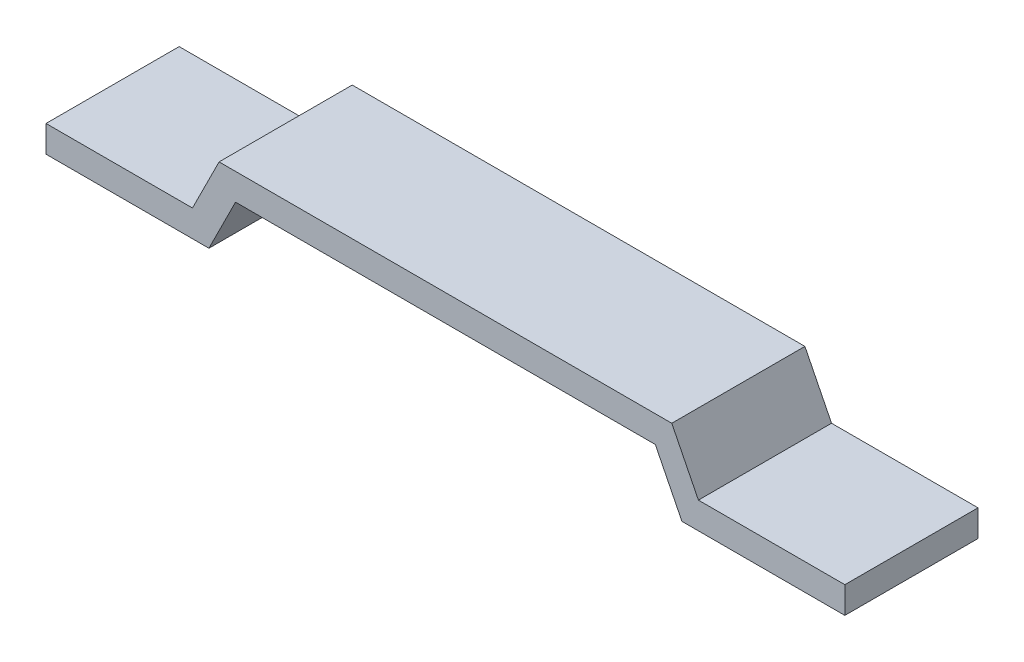
ISO-10303-21;
HEADER;
FILE_DESCRIPTION(('STEP AP214'),'2;1');
FILE_NAME('part.step','',(''),(''),'','','');
FILE_SCHEMA(('AUTOMOTIVE_DESIGN { 1 0 10303 214 1 1 1 1 }'));
ENDSEC;
DATA;
#1=APPLICATION_CONTEXT('core data for automotive mechanical design processes');
#2=APPLICATION_PROTOCOL_DEFINITION('international standard','automotive_design',2000,#1);
#3=PRODUCT_CONTEXT('',#1,'mechanical');
#4=PRODUCT('Part','Part','',(#3));
#5=PRODUCT_RELATED_PRODUCT_CATEGORY('part','',(#4));
#6=PRODUCT_DEFINITION_FORMATION('','',#4);
#7=PRODUCT_DEFINITION_CONTEXT('part definition',#1,'design');
#8=PRODUCT_DEFINITION('design','',#6,#7);
#9=PRODUCT_DEFINITION_SHAPE('','',#8);
#10=(LENGTH_UNIT() NAMED_UNIT(*) SI_UNIT(.MILLI.,.METRE.));
#11=(NAMED_UNIT(*) PLANE_ANGLE_UNIT() SI_UNIT($,.RADIAN.));
#12=(NAMED_UNIT(*) SI_UNIT($,.STERADIAN.) SOLID_ANGLE_UNIT());
#13=UNCERTAINTY_MEASURE_WITH_UNIT(LENGTH_MEASURE(1.E-05),#10,'distance_accuracy_value','');
#14=(GEOMETRIC_REPRESENTATION_CONTEXT(3) GLOBAL_UNCERTAINTY_ASSIGNED_CONTEXT((#13)) GLOBAL_UNIT_ASSIGNED_CONTEXT((#10,
#11,#12)) REPRESENTATION_CONTEXT('',''));
#15=CARTESIAN_POINT('',(0.,0.,0.));
#16=DIRECTION('',(0.,0.,1.));
#17=DIRECTION('',(1.,0.,0.));
#18=AXIS2_PLACEMENT_3D('',#15,#16,#17);
#19=CARTESIAN_POINT('',(-150.,10.,50.));
#20=DIRECTION('',(0.,-1.,0.));
#21=DIRECTION('',(0.,0.,-1.));
#22=AXIS2_PLACEMENT_3D('',#19,#20,#21);
#23=PLANE('',#22);
#24=DIRECTION('',(-1.,0.,0.));
#25=VECTOR('',#24,1.);
#26=CARTESIAN_POINT('',(-150.,10.,0.));
#27=LINE('',#26,#25);
#28=CARTESIAN_POINT('',(-95.,10.,0.));
#29=VERTEX_POINT('',#28);
#30=CARTESIAN_POINT('',(-150.,10.,0.));
#31=VERTEX_POINT('',#30);
#32=EDGE_CURVE('E164',#29,#31,#27,.T.);
#33=ORIENTED_EDGE('',*,*,#32,.T.);
#34=DIRECTION('',(0.,0.,-1.));
#35=VECTOR('',#34,1.);
#36=CARTESIAN_POINT('',(-150.,10.,50.));
#37=LINE('',#36,#35);
#38=CARTESIAN_POINT('',(-150.,10.,50.));
#39=VERTEX_POINT('',#38);
#40=EDGE_CURVE('E11',#39,#31,#37,.T.);
#41=ORIENTED_EDGE('',*,*,#40,.F.);
#42=DIRECTION('',(-1.,0.,0.));
#43=VECTOR('',#42,1.);
#44=CARTESIAN_POINT('',(-150.,10.,50.));
#45=LINE('',#44,#43);
#46=CARTESIAN_POINT('',(-95.,10.,50.));
#47=VERTEX_POINT('',#46);
#48=EDGE_CURVE('E201',#47,#39,#45,.T.);
#49=ORIENTED_EDGE('',*,*,#48,.F.);
#50=DIRECTION('',(0.,0.,-1.));
#51=VECTOR('',#50,1.);
#52=CARTESIAN_POINT('',(-95.,10.,50.));
#53=LINE('',#52,#51);
#54=EDGE_CURVE('E160',#47,#29,#53,.T.);
#55=ORIENTED_EDGE('',*,*,#54,.T.);
#56=EDGE_LOOP('',(#33,#41,#49,#55));
#57=FACE_BOUND('',#56,.T.);
#58=ADVANCED_FACE('F39',(#57),#23,.F.);
#59=CARTESIAN_POINT('',(-150.,0.,50.));
#60=DIRECTION('',(1.,0.,0.));
#61=DIRECTION('',(0.,0.,-1.));
#62=AXIS2_PLACEMENT_3D('',#59,#60,#61);
#63=PLANE('',#62);
#64=DIRECTION('',(0.,-1.,0.));
#65=VECTOR('',#64,1.);
#66=CARTESIAN_POINT('',(-150.,0.,0.));
#67=LINE('',#66,#65);
#68=CARTESIAN_POINT('',(-150.,0.,0.));
#69=VERTEX_POINT('',#68);
#70=EDGE_CURVE('E168',#31,#69,#67,.T.);
#71=ORIENTED_EDGE('',*,*,#70,.T.);
#72=DIRECTION('',(0.,0.,-1.));
#73=VECTOR('',#72,1.);
#74=CARTESIAN_POINT('',(-150.,0.,50.));
#75=LINE('',#74,#73);
#76=CARTESIAN_POINT('',(-150.,0.,50.));
#77=VERTEX_POINT('',#76);
#78=EDGE_CURVE('E48',#77,#69,#75,.T.);
#79=ORIENTED_EDGE('',*,*,#78,.F.);
#80=DIRECTION('',(0.,-1.,0.));
#81=VECTOR('',#80,1.);
#82=CARTESIAN_POINT('',(-150.,0.,50.));
#83=LINE('',#82,#81);
#84=EDGE_CURVE('E110',#39,#77,#83,.T.);
#85=ORIENTED_EDGE('',*,*,#84,.F.);
#86=ORIENTED_EDGE('',*,*,#40,.T.);
#87=EDGE_LOOP('',(#71,#79,#85,#86));
#88=FACE_BOUND('',#87,.T.);
#89=ADVANCED_FACE('F238',(#88),#63,.F.);
#90=CARTESIAN_POINT('',(-140.,0.,50.));
#91=DIRECTION('',(0.,1.,0.));
#92=DIRECTION('',(0.,0.,1.));
#93=AXIS2_PLACEMENT_3D('',#90,#91,#92);
#94=PLANE('',#93);
#95=DIRECTION('',(1.,0.,0.));
#96=VECTOR('',#95,1.);
#97=CARTESIAN_POINT('',(-140.,0.,0.));
#98=LINE('',#97,#96);
#99=CARTESIAN_POINT('',(-88.819660112501,0.,0.));
#100=VERTEX_POINT('',#99);
#101=EDGE_CURVE('E172',#69,#100,#98,.T.);
#102=ORIENTED_EDGE('',*,*,#101,.T.);
#103=DIRECTION('',(0.,0.,-1.));
#104=VECTOR('',#103,1.);
#105=CARTESIAN_POINT('',(-88.819660112501,0.,50.));
#106=LINE('',#105,#104);
#107=CARTESIAN_POINT('',(-88.819660112501,0.,50.));
#108=VERTEX_POINT('',#107);
#109=EDGE_CURVE('E228',#108,#100,#106,.T.);
#110=ORIENTED_EDGE('',*,*,#109,.F.);
#111=DIRECTION('',(1.,0.,0.));
#112=VECTOR('',#111,1.);
#113=CARTESIAN_POINT('',(-140.,0.,50.));
#114=LINE('',#113,#112);
#115=EDGE_CURVE('E237',#77,#108,#114,.T.);
#116=ORIENTED_EDGE('',*,*,#115,.F.);
#117=ORIENTED_EDGE('',*,*,#78,.T.);
#118=EDGE_LOOP('',(#102,#110,#116,#117));
#119=FACE_BOUND('',#118,.T.);
#120=ADVANCED_FACE('F235',(#119),#94,.F.);
#121=CARTESIAN_POINT('',(-88.819660112501,0.,50.));
#122=DIRECTION('',(-0.894427190999916,0.447213595499958,0.));
#123=DIRECTION('',(-0.447213595499958,-0.894427190999916,0.));
#124=AXIS2_PLACEMENT_3D('',#121,#122,#123);
#125=PLANE('',#124);
#126=DIRECTION('',(0.447213595499958,0.894427190999916,0.));
#127=VECTOR('',#126,1.);
#128=CARTESIAN_POINT('',(-88.819660112501,0.,0.));
#129=LINE('',#128,#127);
#130=CARTESIAN_POINT('',(-78.8196601125011,20.,0.));
#131=VERTEX_POINT('',#130);
#132=EDGE_CURVE('E175',#100,#131,#129,.T.);
#133=ORIENTED_EDGE('',*,*,#132,.T.);
#134=DIRECTION('',(0.,0.,-1.));
#135=VECTOR('',#134,1.);
#136=CARTESIAN_POINT('',(-78.8196601125011,20.,50.));
#137=LINE('',#136,#135);
#138=CARTESIAN_POINT('',(-78.8196601125011,20.,50.));
#139=VERTEX_POINT('',#138);
#140=EDGE_CURVE('E224',#139,#131,#137,.T.);
#141=ORIENTED_EDGE('',*,*,#140,.F.);
#142=DIRECTION('',(0.447213595499958,0.894427190999916,0.));
#143=VECTOR('',#142,1.);
#144=CARTESIAN_POINT('',(-88.819660112501,0.,50.));
#145=LINE('',#144,#143);
#146=EDGE_CURVE('E257',#108,#139,#145,.T.);
#147=ORIENTED_EDGE('',*,*,#146,.F.);
#148=ORIENTED_EDGE('',*,*,#109,.T.);
#149=EDGE_LOOP('',(#133,#141,#147,#148));
#150=FACE_BOUND('',#149,.T.);
#151=ADVANCED_FACE('F247',(#150),#125,.F.);
#152=CARTESIAN_POINT('',(78.8196601125011,20.,50.));
#153=DIRECTION('',(0.,1.,0.));
#154=DIRECTION('',(0.,0.,1.));
#155=AXIS2_PLACEMENT_3D('',#152,#153,#154);
#156=PLANE('',#155);
#157=DIRECTION('',(1.,0.,0.));
#158=VECTOR('',#157,1.);
#159=CARTESIAN_POINT('',(78.8196601125011,20.,0.));
#160=LINE('',#159,#158);
#161=CARTESIAN_POINT('',(78.8196601125011,20.,0.));
#162=VERTEX_POINT('',#161);
#163=EDGE_CURVE('E179',#131,#162,#160,.T.);
#164=ORIENTED_EDGE('',*,*,#163,.T.);
#165=DIRECTION('',(0.,0.,-1.));
#166=VECTOR('',#165,1.);
#167=CARTESIAN_POINT('',(78.8196601125011,20.,50.));
#168=LINE('',#167,#166);
#169=CARTESIAN_POINT('',(78.8196601125011,20.,50.));
#170=VERTEX_POINT('',#169);
#171=EDGE_CURVE('E220',#170,#162,#168,.T.);
#172=ORIENTED_EDGE('',*,*,#171,.F.);
#173=DIRECTION('',(1.,0.,0.));
#174=VECTOR('',#173,1.);
#175=CARTESIAN_POINT('',(-78.8196601125011,20.,50.));
#176=LINE('',#175,#174);
#177=EDGE_CURVE('E253',#139,#170,#176,.T.);
#178=ORIENTED_EDGE('',*,*,#177,.F.);
#179=ORIENTED_EDGE('',*,*,#140,.T.);
#180=EDGE_LOOP('',(#164,#172,#178,#179));
#181=FACE_BOUND('',#180,.T.);
#182=ADVANCED_FACE('F251',(#181),#156,.F.);
#183=CARTESIAN_POINT('',(88.819660112501,0.,50.));
#184=DIRECTION('',(0.894427190999916,0.447213595499958,0.));
#185=DIRECTION('',(-0.447213595499958,0.894427190999916,0.));
#186=AXIS2_PLACEMENT_3D('',#183,#184,#185);
#187=PLANE('',#186);
#188=DIRECTION('',(0.447213595499958,-0.894427190999916,0.));
#189=VECTOR('',#188,1.);
#190=CARTESIAN_POINT('',(88.819660112501,0.,0.));
#191=LINE('',#190,#189);
#192=CARTESIAN_POINT('',(88.819660112501,0.,0.));
#193=VERTEX_POINT('',#192);
#194=EDGE_CURVE('E182',#162,#193,#191,.T.);
#195=ORIENTED_EDGE('',*,*,#194,.T.);
#196=DIRECTION('',(0.,0.,-1.));
#197=VECTOR('',#196,1.);
#198=CARTESIAN_POINT('',(88.819660112501,0.,50.));
#199=LINE('',#198,#197);
#200=CARTESIAN_POINT('',(88.819660112501,0.,50.));
#201=VERTEX_POINT('',#200);
#202=EDGE_CURVE('E216',#201,#193,#199,.T.);
#203=ORIENTED_EDGE('',*,*,#202,.F.);
#204=DIRECTION('',(0.447213595499958,-0.894427190999916,0.));
#205=VECTOR('',#204,1.);
#206=CARTESIAN_POINT('',(88.819660112501,0.,50.));
#207=LINE('',#206,#205);
#208=EDGE_CURVE('E256',#170,#201,#207,.T.);
#209=ORIENTED_EDGE('',*,*,#208,.F.);
#210=ORIENTED_EDGE('',*,*,#171,.T.);
#211=EDGE_LOOP('',(#195,#203,#209,#210));
#212=FACE_BOUND('',#211,.T.);
#213=ADVANCED_FACE('F284',(#212),#187,.F.);
#214=CARTESIAN_POINT('',(140.,0.,50.));
#215=DIRECTION('',(0.,1.,0.));
#216=DIRECTION('',(-1.,0.,0.));
#217=AXIS2_PLACEMENT_3D('',#214,#215,#216);
#218=PLANE('',#217);
#219=DIRECTION('',(1.,0.,0.));
#220=VECTOR('',#219,1.);
#221=CARTESIAN_POINT('',(140.,0.,0.));
#222=LINE('',#221,#220);
#223=CARTESIAN_POINT('',(150.,0.,0.));
#224=VERTEX_POINT('',#223);
#225=EDGE_CURVE('E186',#193,#224,#222,.T.);
#226=ORIENTED_EDGE('',*,*,#225,.T.);
#227=DIRECTION('',(0.,0.,-1.));
#228=VECTOR('',#227,1.);
#229=CARTESIAN_POINT('',(150.,0.,50.));
#230=LINE('',#229,#228);
#231=CARTESIAN_POINT('',(150.,0.,50.));
#232=VERTEX_POINT('',#231);
#233=EDGE_CURVE('E212',#232,#224,#230,.T.);
#234=ORIENTED_EDGE('',*,*,#233,.F.);
#235=DIRECTION('',(1.,0.,0.));
#236=VECTOR('',#235,1.);
#237=CARTESIAN_POINT('',(140.,0.,50.));
#238=LINE('',#237,#236);
#239=EDGE_CURVE('E261',#201,#232,#238,.T.);
#240=ORIENTED_EDGE('',*,*,#239,.F.);
#241=ORIENTED_EDGE('',*,*,#202,.T.);
#242=EDGE_LOOP('',(#226,#234,#240,#241));
#243=FACE_BOUND('',#242,.T.);
#244=ADVANCED_FACE('F285',(#243),#218,.F.);
#245=CARTESIAN_POINT('',(150.,0.,50.));
#246=DIRECTION('',(-1.,0.,0.));
#247=DIRECTION('',(0.,0.,1.));
#248=AXIS2_PLACEMENT_3D('',#245,#246,#247);
#249=PLANE('',#248);
#250=DIRECTION('',(0.,1.,0.));
#251=VECTOR('',#250,1.);
#252=CARTESIAN_POINT('',(150.,0.,0.));
#253=LINE('',#252,#251);
#254=CARTESIAN_POINT('',(150.,10.,0.));
#255=VERTEX_POINT('',#254);
#256=EDGE_CURVE('E189',#224,#255,#253,.T.);
#257=ORIENTED_EDGE('',*,*,#256,.T.);
#258=DIRECTION('',(0.,0.,-1.));
#259=VECTOR('',#258,1.);
#260=CARTESIAN_POINT('',(150.,10.,50.));
#261=LINE('',#260,#259);
#262=CARTESIAN_POINT('',(150.,10.,50.));
#263=VERTEX_POINT('',#262);
#264=EDGE_CURVE('E208',#263,#255,#261,.T.);
#265=ORIENTED_EDGE('',*,*,#264,.F.);
#266=DIRECTION('',(0.,1.,0.));
#267=VECTOR('',#266,1.);
#268=CARTESIAN_POINT('',(150.,0.,50.));
#269=LINE('',#268,#267);
#270=EDGE_CURVE('E268',#232,#263,#269,.T.);
#271=ORIENTED_EDGE('',*,*,#270,.F.);
#272=ORIENTED_EDGE('',*,*,#233,.T.);
#273=EDGE_LOOP('',(#257,#265,#271,#272));
#274=FACE_BOUND('',#273,.T.);
#275=ADVANCED_FACE('F276',(#274),#249,.F.);
#276=CARTESIAN_POINT('',(150.,10.,50.));
#277=DIRECTION('',(0.,-1.,0.));
#278=DIRECTION('',(1.,0.,0.));
#279=AXIS2_PLACEMENT_3D('',#276,#277,#278);
#280=PLANE('',#279);
#281=DIRECTION('',(-1.,0.,0.));
#282=VECTOR('',#281,1.);
#283=CARTESIAN_POINT('',(150.,10.,0.));
#284=LINE('',#283,#282);
#285=CARTESIAN_POINT('',(95.,10.,0.));
#286=VERTEX_POINT('',#285);
#287=EDGE_CURVE('E192',#255,#286,#284,.T.);
#288=ORIENTED_EDGE('',*,*,#287,.T.);
#289=DIRECTION('',(0.,0.,-1.));
#290=VECTOR('',#289,1.);
#291=CARTESIAN_POINT('',(95.,10.,50.));
#292=LINE('',#291,#290);
#293=CARTESIAN_POINT('',(95.,10.,50.));
#294=VERTEX_POINT('',#293);
#295=EDGE_CURVE('E153',#294,#286,#292,.T.);
#296=ORIENTED_EDGE('',*,*,#295,.F.);
#297=DIRECTION('',(-1.,0.,0.));
#298=VECTOR('',#297,1.);
#299=CARTESIAN_POINT('',(150.,10.,50.));
#300=LINE('',#299,#298);
#301=EDGE_CURVE('E141',#263,#294,#300,.T.);
#302=ORIENTED_EDGE('',*,*,#301,.F.);
#303=ORIENTED_EDGE('',*,*,#264,.T.);
#304=EDGE_LOOP('',(#288,#296,#302,#303));
#305=FACE_BOUND('',#304,.T.);
#306=ADVANCED_FACE('F280',(#305),#280,.F.);
#307=CARTESIAN_POINT('',(95.,10.,50.));
#308=DIRECTION('',(-0.894427190999916,-0.447213595499958,0.));
#309=DIRECTION('',(0.447213595499958,-0.894427190999916,0.));
#310=AXIS2_PLACEMENT_3D('',#307,#308,#309);
#311=PLANE('',#310);
#312=DIRECTION('',(-0.447213595499958,0.894427190999916,0.));
#313=VECTOR('',#312,1.);
#314=CARTESIAN_POINT('',(95.,10.,0.));
#315=LINE('',#314,#313);
#316=CARTESIAN_POINT('',(85.,30.,0.));
#317=VERTEX_POINT('',#316);
#318=EDGE_CURVE('E151',#286,#317,#315,.T.);
#319=ORIENTED_EDGE('',*,*,#318,.T.);
#320=DIRECTION('',(0.,0.,-1.));
#321=VECTOR('',#320,1.);
#322=CARTESIAN_POINT('',(85.,30.,50.));
#323=LINE('',#322,#321);
#324=CARTESIAN_POINT('',(85.,30.,50.));
#325=VERTEX_POINT('',#324);
#326=EDGE_CURVE('E148',#325,#317,#323,.T.);
#327=ORIENTED_EDGE('',*,*,#326,.F.);
#328=DIRECTION('',(-0.447213595499958,0.894427190999916,0.));
#329=VECTOR('',#328,1.);
#330=CARTESIAN_POINT('',(95.,10.,50.));
#331=LINE('',#330,#329);
#332=EDGE_CURVE('E135',#294,#325,#331,.T.);
#333=ORIENTED_EDGE('',*,*,#332,.F.);
#334=ORIENTED_EDGE('',*,*,#295,.T.);
#335=EDGE_LOOP('',(#319,#327,#333,#334));
#336=FACE_BOUND('',#335,.T.);
#337=ADVANCED_FACE('F149',(#336),#311,.F.);
#338=CARTESIAN_POINT('',(-85.,30.,50.));
#339=DIRECTION('',(0.,-1.,0.));
#340=DIRECTION('',(1.,0.,0.));
#341=AXIS2_PLACEMENT_3D('',#338,#339,#340);
#342=PLANE('',#341);
#343=DIRECTION('',(-1.,0.,0.));
#344=VECTOR('',#343,1.);
#345=CARTESIAN_POINT('',(-85.,30.,0.));
#346=LINE('',#345,#344);
#347=CARTESIAN_POINT('',(-85.,30.,0.));
#348=VERTEX_POINT('',#347);
#349=EDGE_CURVE('E96',#317,#348,#346,.T.);
#350=ORIENTED_EDGE('',*,*,#349,.T.);
#351=DIRECTION('',(0.,0.,-1.));
#352=VECTOR('',#351,1.);
#353=CARTESIAN_POINT('',(-85.,30.,50.));
#354=LINE('',#353,#352);
#355=CARTESIAN_POINT('',(-85.,30.,50.));
#356=VERTEX_POINT('',#355);
#357=EDGE_CURVE('E154',#356,#348,#354,.T.);
#358=ORIENTED_EDGE('',*,*,#357,.F.);
#359=DIRECTION('',(-1.,0.,0.));
#360=VECTOR('',#359,1.);
#361=CARTESIAN_POINT('',(85.,30.,50.));
#362=LINE('',#361,#360);
#363=EDGE_CURVE('E139',#325,#356,#362,.T.);
#364=ORIENTED_EDGE('',*,*,#363,.F.);
#365=ORIENTED_EDGE('',*,*,#326,.T.);
#366=EDGE_LOOP('',(#350,#358,#364,#365));
#367=FACE_BOUND('',#366,.T.);
#368=ADVANCED_FACE('F156',(#367),#342,.F.);
#369=CARTESIAN_POINT('',(-95.,10.,50.));
#370=DIRECTION('',(0.894427190999916,-0.447213595499958,0.));
#371=DIRECTION('',(0.447213595499958,0.894427190999916,0.));
#372=AXIS2_PLACEMENT_3D('',#369,#370,#371);
#373=PLANE('',#372);
#374=DIRECTION('',(-0.447213595499958,-0.894427190999916,0.));
#375=VECTOR('',#374,1.);
#376=CARTESIAN_POINT('',(-95.,10.,0.));
#377=LINE('',#376,#375);
#378=EDGE_CURVE('E102',#348,#29,#377,.T.);
#379=ORIENTED_EDGE('',*,*,#378,.T.);
#380=ORIENTED_EDGE('',*,*,#54,.F.);
#381=DIRECTION('',(-0.447213595499958,-0.894427190999916,0.));
#382=VECTOR('',#381,1.);
#383=CARTESIAN_POINT('',(-95.,10.,50.));
#384=LINE('',#383,#382);
#385=EDGE_CURVE('E56',#356,#47,#384,.T.);
#386=ORIENTED_EDGE('',*,*,#385,.F.);
#387=ORIENTED_EDGE('',*,*,#357,.T.);
#388=EDGE_LOOP('',(#379,#380,#386,#387));
#389=FACE_BOUND('',#388,.T.);
#390=ADVANCED_FACE('F300',(#389),#373,.F.);
#391=CARTESIAN_POINT('',(0.,0.,50.));
#392=DIRECTION('',(0.,0.,1.));
#393=DIRECTION('',(1.,0.,0.));
#394=AXIS2_PLACEMENT_3D('',#391,#392,#393);
#395=PLANE('',#394);
#396=ORIENTED_EDGE('',*,*,#48,.T.);
#397=ORIENTED_EDGE('',*,*,#84,.T.);
#398=ORIENTED_EDGE('',*,*,#115,.T.);
#399=ORIENTED_EDGE('',*,*,#146,.T.);
#400=ORIENTED_EDGE('',*,*,#177,.T.);
#401=ORIENTED_EDGE('',*,*,#208,.T.);
#402=ORIENTED_EDGE('',*,*,#239,.T.);
#403=ORIENTED_EDGE('',*,*,#270,.T.);
#404=ORIENTED_EDGE('',*,*,#301,.T.);
#405=ORIENTED_EDGE('',*,*,#332,.T.);
#406=ORIENTED_EDGE('',*,*,#363,.T.);
#407=ORIENTED_EDGE('',*,*,#385,.T.);
#408=EDGE_LOOP('',(#396,#397,#398,#399,#400,#401,#402,#403,#404,#405,#406,#407));
#409=FACE_BOUND('',#408,.T.);
#410=ADVANCED_FACE('F137',(#409),#395,.T.);
#411=CARTESIAN_POINT('',(0.,0.,0.));
#412=DIRECTION('',(0.,0.,1.));
#413=DIRECTION('',(1.,0.,0.));
#414=AXIS2_PLACEMENT_3D('',#411,#412,#413);
#415=PLANE('',#414);
#416=ORIENTED_EDGE('',*,*,#32,.F.);
#417=ORIENTED_EDGE('',*,*,#378,.F.);
#418=ORIENTED_EDGE('',*,*,#349,.F.);
#419=ORIENTED_EDGE('',*,*,#318,.F.);
#420=ORIENTED_EDGE('',*,*,#287,.F.);
#421=ORIENTED_EDGE('',*,*,#256,.F.);
#422=ORIENTED_EDGE('',*,*,#225,.F.);
#423=ORIENTED_EDGE('',*,*,#194,.F.);
#424=ORIENTED_EDGE('',*,*,#163,.F.);
#425=ORIENTED_EDGE('',*,*,#132,.F.);
#426=ORIENTED_EDGE('',*,*,#101,.F.);
#427=ORIENTED_EDGE('',*,*,#70,.F.);
#428=EDGE_LOOP('',(#416,#417,#418,#419,#420,#421,#422,#423,#424,#425,#426,#427));
#429=FACE_BOUND('',#428,.T.);
#430=ADVANCED_FACE('F242',(#429),#415,.F.);
#431=CLOSED_SHELL('',(#58,#89,#120,#151,#182,#213,#244,#275,#306,#337,#368,#390,#410,#430));
#432=MANIFOLD_SOLID_BREP('B2',#431);
#433=ADVANCED_BREP_SHAPE_REPRESENTATION('',(#18,#432),#14);
#434=SHAPE_DEFINITION_REPRESENTATION(#9,#433);
ENDSEC;
END-ISO-10303-21;
